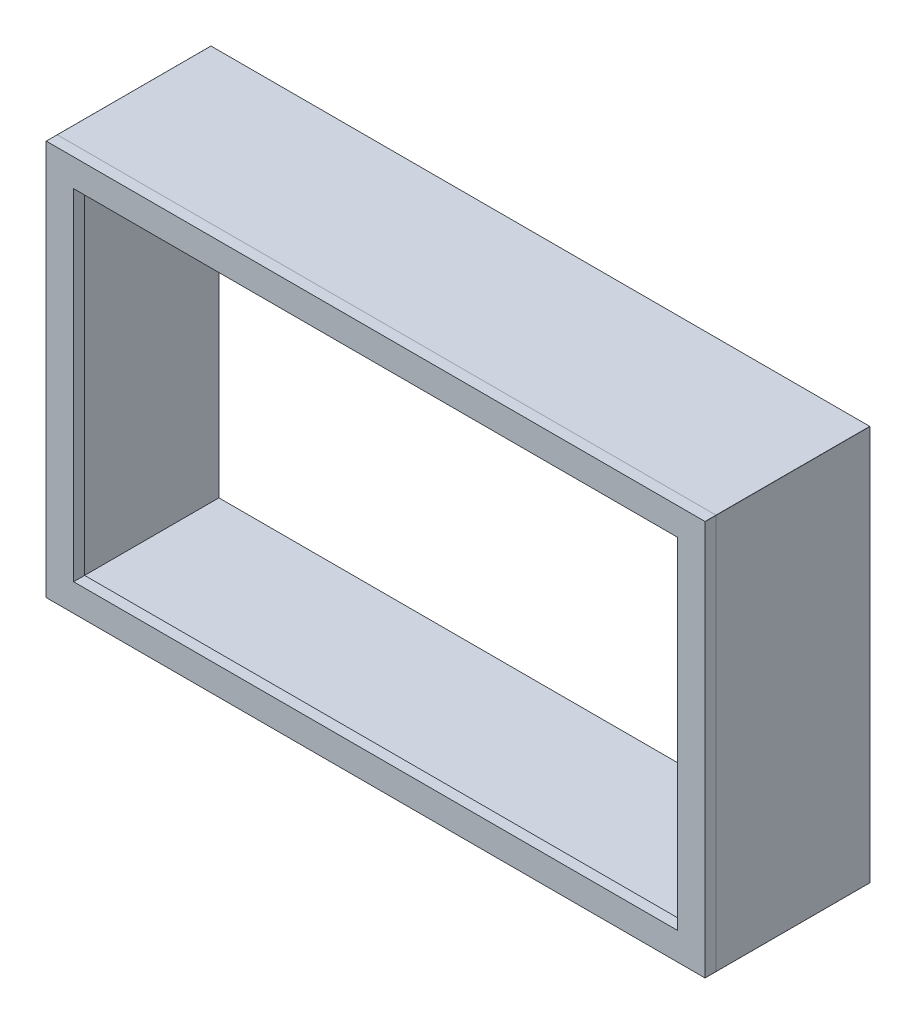
ISO-10303-21;
HEADER;
FILE_DESCRIPTION(('STEP AP214'),'2;1');
FILE_NAME('part.step','',(''),(''),'','','');
FILE_SCHEMA(('AUTOMOTIVE_DESIGN { 1 0 10303 214 1 1 1 1 }'));
ENDSEC;
DATA;
#1=APPLICATION_CONTEXT('core data for automotive mechanical design processes');
#2=APPLICATION_PROTOCOL_DEFINITION('international standard','automotive_design',2000,#1);
#3=PRODUCT_CONTEXT('',#1,'mechanical');
#4=PRODUCT('Part','Part','',(#3));
#5=PRODUCT_RELATED_PRODUCT_CATEGORY('part','',(#4));
#6=PRODUCT_DEFINITION_FORMATION('','',#4);
#7=PRODUCT_DEFINITION_CONTEXT('part definition',#1,'design');
#8=PRODUCT_DEFINITION('design','',#6,#7);
#9=PRODUCT_DEFINITION_SHAPE('','',#8);
#10=(LENGTH_UNIT() NAMED_UNIT(*) SI_UNIT(.MILLI.,.METRE.));
#11=(NAMED_UNIT(*) PLANE_ANGLE_UNIT() SI_UNIT($,.RADIAN.));
#12=(NAMED_UNIT(*) SI_UNIT($,.STERADIAN.) SOLID_ANGLE_UNIT());
#13=UNCERTAINTY_MEASURE_WITH_UNIT(LENGTH_MEASURE(1.E-05),#10,'distance_accuracy_value','');
#14=(GEOMETRIC_REPRESENTATION_CONTEXT(3) GLOBAL_UNCERTAINTY_ASSIGNED_CONTEXT((#13)) GLOBAL_UNIT_ASSIGNED_CONTEXT((#10,
#11,#12)) REPRESENTATION_CONTEXT('',''));
#15=CARTESIAN_POINT('',(0.,0.,0.));
#16=DIRECTION('',(0.,0.,1.));
#17=DIRECTION('',(1.,0.,0.));
#18=AXIS2_PLACEMENT_3D('',#15,#16,#17);
#19=CARTESIAN_POINT('',(-761.746,-456.946,228.6));
#20=DIRECTION('',(0.,0.,1.));
#21=DIRECTION('',(1.,0.,0.));
#22=AXIS2_PLACEMENT_3D('',#19,#20,#21);
#23=PLANE('',#22);
#24=CARTESIAN_POINT('',(-761.746,-456.946,228.6));
#25=DIRECTION('',(0.,0.,1.));
#26=DIRECTION('',(1.,0.,0.));
#27=AXIS2_PLACEMENT_3D('',#24,#25,#26);
#28=CIRCLE('',#27,0.253999999999949);
#29=CARTESIAN_POINT('',(-762.,-456.946,228.6));
#30=VERTEX_POINT('',#29);
#31=CARTESIAN_POINT('',(-761.746,-457.2,228.6));
#32=VERTEX_POINT('',#31);
#33=EDGE_CURVE('E280',#30,#32,#28,.T.);
#34=ORIENTED_EDGE('',*,*,#33,.T.);
#35=DIRECTION('',(1.,0.,0.));
#36=VECTOR('',#35,1.);
#37=CARTESIAN_POINT('',(-761.746,-457.2,228.6));
#38=LINE('',#37,#36);
#39=CARTESIAN_POINT('',(761.746,-457.2,228.6));
#40=VERTEX_POINT('',#39);
#41=EDGE_CURVE('E283',#32,#40,#38,.T.);
#42=ORIENTED_EDGE('',*,*,#41,.T.);
#43=CARTESIAN_POINT('',(761.746,-456.946,228.6));
#44=DIRECTION('',(0.,0.,1.));
#45=DIRECTION('',(1.,0.,0.));
#46=AXIS2_PLACEMENT_3D('',#43,#44,#45);
#47=CIRCLE('',#46,0.253999999999976);
#48=CARTESIAN_POINT('',(762.,-456.946,228.6));
#49=VERTEX_POINT('',#48);
#50=EDGE_CURVE('E286',#40,#49,#47,.T.);
#51=ORIENTED_EDGE('',*,*,#50,.T.);
#52=DIRECTION('',(0.,1.,0.));
#53=VECTOR('',#52,1.);
#54=CARTESIAN_POINT('',(762.,-456.946,228.6));
#55=LINE('',#54,#53);
#56=CARTESIAN_POINT('',(762.,456.946,228.6));
#57=VERTEX_POINT('',#56);
#58=EDGE_CURVE('E288',#49,#57,#55,.T.);
#59=ORIENTED_EDGE('',*,*,#58,.T.);
#60=CARTESIAN_POINT('',(761.746,456.946,228.6));
#61=DIRECTION('',(0.,0.,1.));
#62=DIRECTION('',(1.,0.,0.));
#63=AXIS2_PLACEMENT_3D('',#60,#61,#62);
#64=CIRCLE('',#63,0.253999999999976);
#65=CARTESIAN_POINT('',(761.746,457.2,228.6));
#66=VERTEX_POINT('',#65);
#67=EDGE_CURVE('E290',#57,#66,#64,.T.);
#68=ORIENTED_EDGE('',*,*,#67,.T.);
#69=DIRECTION('',(-1.,0.,0.));
#70=VECTOR('',#69,1.);
#71=CARTESIAN_POINT('',(761.746,457.2,228.6));
#72=LINE('',#71,#70);
#73=CARTESIAN_POINT('',(-761.746,457.2,228.6));
#74=VERTEX_POINT('',#73);
#75=EDGE_CURVE('E292',#66,#74,#72,.T.);
#76=ORIENTED_EDGE('',*,*,#75,.T.);
#77=CARTESIAN_POINT('',(-761.746,456.946,228.6));
#78=DIRECTION('',(0.,0.,1.));
#79=DIRECTION('',(1.,0.,0.));
#80=AXIS2_PLACEMENT_3D('',#77,#78,#79);
#81=CIRCLE('',#80,0.254000000000004);
#82=CARTESIAN_POINT('',(-762.,456.946,228.6));
#83=VERTEX_POINT('',#82);
#84=EDGE_CURVE('E294',#74,#83,#81,.T.);
#85=ORIENTED_EDGE('',*,*,#84,.T.);
#86=DIRECTION('',(0.,-1.,0.));
#87=VECTOR('',#86,1.);
#88=CARTESIAN_POINT('',(-762.,456.946,228.6));
#89=LINE('',#88,#87);
#90=EDGE_CURVE('E296',#83,#30,#89,.T.);
#91=ORIENTED_EDGE('',*,*,#90,.T.);
#92=EDGE_LOOP('',(#34,#42,#51,#59,#68,#76,#85,#91));
#93=FACE_BOUND('',#92,.T.);
#94=DIRECTION('',(0.,1.,0.));
#95=VECTOR('',#94,1.);
#96=CARTESIAN_POINT('',(698.5,-456.946,228.6));
#97=LINE('',#96,#95);
#98=CARTESIAN_POINT('',(698.5,-393.7,228.6));
#99=VERTEX_POINT('',#98);
#100=CARTESIAN_POINT('',(698.5,393.7,228.6));
#101=VERTEX_POINT('',#100);
#102=EDGE_CURVE('E252',#99,#101,#97,.T.);
#103=ORIENTED_EDGE('',*,*,#102,.F.);
#104=DIRECTION('',(1.,0.,0.));
#105=VECTOR('',#104,1.);
#106=CARTESIAN_POINT('',(-761.746,-393.7,228.6));
#107=LINE('',#106,#105);
#108=CARTESIAN_POINT('',(-698.5,-393.7,228.6));
#109=VERTEX_POINT('',#108);
#110=EDGE_CURVE('E244',#109,#99,#107,.T.);
#111=ORIENTED_EDGE('',*,*,#110,.F.);
#112=DIRECTION('',(0.,-1.,0.));
#113=VECTOR('',#112,1.);
#114=CARTESIAN_POINT('',(-698.5,456.946,228.6));
#115=LINE('',#114,#113);
#116=CARTESIAN_POINT('',(-698.5,393.7,228.6));
#117=VERTEX_POINT('',#116);
#118=EDGE_CURVE('E266',#117,#109,#115,.T.);
#119=ORIENTED_EDGE('',*,*,#118,.F.);
#120=DIRECTION('',(-1.,0.,0.));
#121=VECTOR('',#120,1.);
#122=CARTESIAN_POINT('',(761.746,393.7,228.6));
#123=LINE('',#122,#121);
#124=EDGE_CURVE('E264',#101,#117,#123,.T.);
#125=ORIENTED_EDGE('',*,*,#124,.F.);
#126=EDGE_LOOP('',(#103,#111,#119,#125));
#127=FACE_BOUND('',#126,.T.);
#128=ADVANCED_FACE('F155',(#93,#127),#23,.T.);
#129=CARTESIAN_POINT('',(-761.746,-456.946,203.2));
#130=DIRECTION('',(0.,0.,1.));
#131=DIRECTION('',(1.,0.,0.));
#132=AXIS2_PLACEMENT_3D('',#129,#130,#131);
#133=PLANE('',#132);
#134=CARTESIAN_POINT('',(-761.746,-456.946,203.2));
#135=DIRECTION('',(0.,0.,1.));
#136=DIRECTION('',(1.,0.,0.));
#137=AXIS2_PLACEMENT_3D('',#134,#135,#136);
#138=CIRCLE('',#137,0.253999999999949);
#139=CARTESIAN_POINT('',(-762.,-456.946,203.2));
#140=VERTEX_POINT('',#139);
#141=CARTESIAN_POINT('',(-761.746,-457.2,203.2));
#142=VERTEX_POINT('',#141);
#143=EDGE_CURVE('E260',#140,#142,#138,.T.);
#144=ORIENTED_EDGE('',*,*,#143,.F.);
#145=DIRECTION('',(0.,-1.,0.));
#146=VECTOR('',#145,1.);
#147=CARTESIAN_POINT('',(-762.,456.946,203.2));
#148=LINE('',#147,#146);
#149=CARTESIAN_POINT('',(-762.,456.946,203.2));
#150=VERTEX_POINT('',#149);
#151=EDGE_CURVE('E284',#150,#140,#148,.T.);
#152=ORIENTED_EDGE('',*,*,#151,.F.);
#153=CARTESIAN_POINT('',(-761.746,456.946,203.2));
#154=DIRECTION('',(0.,0.,1.));
#155=DIRECTION('',(1.,0.,0.));
#156=AXIS2_PLACEMENT_3D('',#153,#154,#155);
#157=CIRCLE('',#156,0.254000000000004);
#158=CARTESIAN_POINT('',(-761.746,457.2,203.2));
#159=VERTEX_POINT('',#158);
#160=EDGE_CURVE('E311',#159,#150,#157,.T.);
#161=ORIENTED_EDGE('',*,*,#160,.F.);
#162=DIRECTION('',(-1.,0.,0.));
#163=VECTOR('',#162,1.);
#164=CARTESIAN_POINT('',(761.746,457.2,203.2));
#165=LINE('',#164,#163);
#166=CARTESIAN_POINT('',(761.746,457.2,203.2));
#167=VERTEX_POINT('',#166);
#168=EDGE_CURVE('E309',#167,#159,#165,.T.);
#169=ORIENTED_EDGE('',*,*,#168,.F.);
#170=CARTESIAN_POINT('',(761.746,456.946,203.2));
#171=DIRECTION('',(0.,0.,1.));
#172=DIRECTION('',(1.,0.,0.));
#173=AXIS2_PLACEMENT_3D('',#170,#171,#172);
#174=CIRCLE('',#173,0.253999999999976);
#175=CARTESIAN_POINT('',(762.,456.946,203.2));
#176=VERTEX_POINT('',#175);
#177=EDGE_CURVE('E307',#176,#167,#174,.T.);
#178=ORIENTED_EDGE('',*,*,#177,.F.);
#179=DIRECTION('',(0.,1.,0.));
#180=VECTOR('',#179,1.);
#181=CARTESIAN_POINT('',(762.,-456.946,203.2));
#182=LINE('',#181,#180);
#183=CARTESIAN_POINT('',(762.,-456.946,203.2));
#184=VERTEX_POINT('',#183);
#185=EDGE_CURVE('E305',#184,#176,#182,.T.);
#186=ORIENTED_EDGE('',*,*,#185,.F.);
#187=CARTESIAN_POINT('',(761.746,-456.946,203.2));
#188=DIRECTION('',(0.,0.,1.));
#189=DIRECTION('',(1.,0.,0.));
#190=AXIS2_PLACEMENT_3D('',#187,#188,#189);
#191=CIRCLE('',#190,0.253999999999976);
#192=CARTESIAN_POINT('',(761.746,-457.2,203.2));
#193=VERTEX_POINT('',#192);
#194=EDGE_CURVE('E303',#193,#184,#191,.T.);
#195=ORIENTED_EDGE('',*,*,#194,.F.);
#196=DIRECTION('',(1.,0.,0.));
#197=VECTOR('',#196,1.);
#198=CARTESIAN_POINT('',(-761.746,-457.2,203.2));
#199=LINE('',#198,#197);
#200=EDGE_CURVE('E301',#142,#193,#199,.T.);
#201=ORIENTED_EDGE('',*,*,#200,.F.);
#202=EDGE_LOOP('',(#144,#152,#161,#169,#178,#186,#195,#201));
#203=FACE_BOUND('',#202,.T.);
#204=DIRECTION('',(1.,0.,0.));
#205=VECTOR('',#204,1.);
#206=CARTESIAN_POINT('',(-761.746,-393.7,203.2));
#207=LINE('',#206,#205);
#208=CARTESIAN_POINT('',(-698.5,-393.7,203.2));
#209=VERTEX_POINT('',#208);
#210=CARTESIAN_POINT('',(698.5,-393.7,203.2));
#211=VERTEX_POINT('',#210);
#212=EDGE_CURVE('E178',#209,#211,#207,.T.);
#213=ORIENTED_EDGE('',*,*,#212,.T.);
#214=DIRECTION('',(0.,1.,0.));
#215=VECTOR('',#214,1.);
#216=CARTESIAN_POINT('',(698.5,-456.946,203.2));
#217=LINE('',#216,#215);
#218=CARTESIAN_POINT('',(698.5,393.7,203.2));
#219=VERTEX_POINT('',#218);
#220=EDGE_CURVE('E259',#211,#219,#217,.T.);
#221=ORIENTED_EDGE('',*,*,#220,.T.);
#222=DIRECTION('',(-1.,0.,0.));
#223=VECTOR('',#222,1.);
#224=CARTESIAN_POINT('',(761.746,393.7,203.2));
#225=LINE('',#224,#223);
#226=CARTESIAN_POINT('',(-698.5,393.7,203.2));
#227=VERTEX_POINT('',#226);
#228=EDGE_CURVE('E272',#219,#227,#225,.T.);
#229=ORIENTED_EDGE('',*,*,#228,.T.);
#230=DIRECTION('',(0.,-1.,0.));
#231=VECTOR('',#230,1.);
#232=CARTESIAN_POINT('',(-698.5,456.946,203.2));
#233=LINE('',#232,#231);
#234=EDGE_CURVE('E253',#227,#209,#233,.T.);
#235=ORIENTED_EDGE('',*,*,#234,.T.);
#236=EDGE_LOOP('',(#213,#221,#229,#235));
#237=FACE_BOUND('',#236,.T.);
#238=ADVANCED_FACE('F341',(#203,#237),#133,.F.);
#239=CARTESIAN_POINT('',(-761.746,-456.946,228.6));
#240=DIRECTION('',(0.,0.,-1.));
#241=DIRECTION('',(-1.,0.,0.));
#242=AXIS2_PLACEMENT_3D('',#239,#240,#241);
#243=CYLINDRICAL_SURFACE('',#242,0.253999999999949);
#244=ORIENTED_EDGE('',*,*,#143,.T.);
#245=DIRECTION('',(0.,0.,-1.));
#246=VECTOR('',#245,1.);
#247=CARTESIAN_POINT('',(-761.746,-457.2,228.6));
#248=LINE('',#247,#246);
#249=EDGE_CURVE('E13',#32,#142,#248,.T.);
#250=ORIENTED_EDGE('',*,*,#249,.F.);
#251=ORIENTED_EDGE('',*,*,#33,.F.);
#252=DIRECTION('',(0.,0.,-1.));
#253=VECTOR('',#252,1.);
#254=CARTESIAN_POINT('',(-762.,-456.946,228.6));
#255=LINE('',#254,#253);
#256=EDGE_CURVE('E298',#30,#140,#255,.T.);
#257=ORIENTED_EDGE('',*,*,#256,.T.);
#258=EDGE_LOOP('',(#244,#250,#251,#257));
#259=FACE_BOUND('',#258,.T.);
#260=ADVANCED_FACE('F157',(#259),#243,.T.);
#261=CARTESIAN_POINT('',(-761.746,-457.2,228.6));
#262=DIRECTION('',(0.,1.,0.));
#263=DIRECTION('',(-1.,0.,0.));
#264=AXIS2_PLACEMENT_3D('',#261,#262,#263);
#265=PLANE('',#264);
#266=ORIENTED_EDGE('',*,*,#200,.T.);
#267=DIRECTION('',(0.,0.,-1.));
#268=VECTOR('',#267,1.);
#269=CARTESIAN_POINT('',(761.746,-457.2,228.6));
#270=LINE('',#269,#268);
#271=EDGE_CURVE('E163',#40,#193,#270,.T.);
#272=ORIENTED_EDGE('',*,*,#271,.F.);
#273=ORIENTED_EDGE('',*,*,#41,.F.);
#274=ORIENTED_EDGE('',*,*,#249,.T.);
#275=EDGE_LOOP('',(#266,#272,#273,#274));
#276=FACE_BOUND('',#275,.T.);
#277=ADVANCED_FACE('F358',(#276),#265,.F.);
#278=CARTESIAN_POINT('',(761.746,-456.946,228.6));
#279=DIRECTION('',(0.,0.,-1.));
#280=DIRECTION('',(-1.,0.,0.));
#281=AXIS2_PLACEMENT_3D('',#278,#279,#280);
#282=CYLINDRICAL_SURFACE('',#281,0.253999999999976);
#283=ORIENTED_EDGE('',*,*,#194,.T.);
#284=DIRECTION('',(0.,0.,-1.));
#285=VECTOR('',#284,1.);
#286=CARTESIAN_POINT('',(762.,-456.946,228.6));
#287=LINE('',#286,#285);
#288=EDGE_CURVE('E328',#49,#184,#287,.T.);
#289=ORIENTED_EDGE('',*,*,#288,.F.);
#290=ORIENTED_EDGE('',*,*,#50,.F.);
#291=ORIENTED_EDGE('',*,*,#271,.T.);
#292=EDGE_LOOP('',(#283,#289,#290,#291));
#293=FACE_BOUND('',#292,.T.);
#294=ADVANCED_FACE('F335',(#293),#282,.T.);
#295=CARTESIAN_POINT('',(762.,-456.946,228.6));
#296=DIRECTION('',(-1.,0.,0.));
#297=DIRECTION('',(0.,0.,1.));
#298=AXIS2_PLACEMENT_3D('',#295,#296,#297);
#299=PLANE('',#298);
#300=ORIENTED_EDGE('',*,*,#185,.T.);
#301=DIRECTION('',(0.,0.,-1.));
#302=VECTOR('',#301,1.);
#303=CARTESIAN_POINT('',(762.,456.946,228.6));
#304=LINE('',#303,#302);
#305=EDGE_CURVE('E325',#57,#176,#304,.T.);
#306=ORIENTED_EDGE('',*,*,#305,.F.);
#307=ORIENTED_EDGE('',*,*,#58,.F.);
#308=ORIENTED_EDGE('',*,*,#288,.T.);
#309=EDGE_LOOP('',(#300,#306,#307,#308));
#310=FACE_BOUND('',#309,.T.);
#311=ADVANCED_FACE('F347',(#310),#299,.F.);
#312=CARTESIAN_POINT('',(761.746,456.946,228.6));
#313=DIRECTION('',(0.,0.,-1.));
#314=DIRECTION('',(-1.,0.,0.));
#315=AXIS2_PLACEMENT_3D('',#312,#313,#314);
#316=CYLINDRICAL_SURFACE('',#315,0.253999999999976);
#317=ORIENTED_EDGE('',*,*,#177,.T.);
#318=DIRECTION('',(0.,0.,-1.));
#319=VECTOR('',#318,1.);
#320=CARTESIAN_POINT('',(761.746,457.2,228.6));
#321=LINE('',#320,#319);
#322=EDGE_CURVE('E322',#66,#167,#321,.T.);
#323=ORIENTED_EDGE('',*,*,#322,.F.);
#324=ORIENTED_EDGE('',*,*,#67,.F.);
#325=ORIENTED_EDGE('',*,*,#305,.T.);
#326=EDGE_LOOP('',(#317,#323,#324,#325));
#327=FACE_BOUND('',#326,.T.);
#328=ADVANCED_FACE('F351',(#327),#316,.T.);
#329=CARTESIAN_POINT('',(761.746,457.2,228.6));
#330=DIRECTION('',(0.,-1.,0.));
#331=DIRECTION('',(1.,0.,0.));
#332=AXIS2_PLACEMENT_3D('',#329,#330,#331);
#333=PLANE('',#332);
#334=ORIENTED_EDGE('',*,*,#168,.T.);
#335=DIRECTION('',(0.,0.,-1.));
#336=VECTOR('',#335,1.);
#337=CARTESIAN_POINT('',(-761.746,457.2,228.6));
#338=LINE('',#337,#336);
#339=EDGE_CURVE('E319',#74,#159,#338,.T.);
#340=ORIENTED_EDGE('',*,*,#339,.F.);
#341=ORIENTED_EDGE('',*,*,#75,.F.);
#342=ORIENTED_EDGE('',*,*,#322,.T.);
#343=EDGE_LOOP('',(#334,#340,#341,#342));
#344=FACE_BOUND('',#343,.T.);
#345=ADVANCED_FACE('F371',(#344),#333,.F.);
#346=CARTESIAN_POINT('',(-761.746,456.946,228.6));
#347=DIRECTION('',(0.,0.,-1.));
#348=DIRECTION('',(-1.,0.,0.));
#349=AXIS2_PLACEMENT_3D('',#346,#347,#348);
#350=CYLINDRICAL_SURFACE('',#349,0.254000000000004);
#351=ORIENTED_EDGE('',*,*,#160,.T.);
#352=DIRECTION('',(0.,0.,-1.));
#353=VECTOR('',#352,1.);
#354=CARTESIAN_POINT('',(-762.,456.946,228.6));
#355=LINE('',#354,#353);
#356=EDGE_CURVE('E316',#83,#150,#355,.T.);
#357=ORIENTED_EDGE('',*,*,#356,.F.);
#358=ORIENTED_EDGE('',*,*,#84,.F.);
#359=ORIENTED_EDGE('',*,*,#339,.T.);
#360=EDGE_LOOP('',(#351,#357,#358,#359));
#361=FACE_BOUND('',#360,.T.);
#362=ADVANCED_FACE('F369',(#361),#350,.T.);
#363=CARTESIAN_POINT('',(-762.,456.946,228.6));
#364=DIRECTION('',(1.,0.,0.));
#365=DIRECTION('',(0.,0.,-1.));
#366=AXIS2_PLACEMENT_3D('',#363,#364,#365);
#367=PLANE('',#366);
#368=ORIENTED_EDGE('',*,*,#151,.T.);
#369=ORIENTED_EDGE('',*,*,#256,.F.);
#370=ORIENTED_EDGE('',*,*,#90,.F.);
#371=ORIENTED_EDGE('',*,*,#356,.T.);
#372=EDGE_LOOP('',(#368,#369,#370,#371));
#373=FACE_BOUND('',#372,.T.);
#374=ADVANCED_FACE('F364',(#373),#367,.F.);
#375=CARTESIAN_POINT('',(-761.746,-393.7,228.6));
#376=DIRECTION('',(0.,1.,0.));
#377=DIRECTION('',(-1.,0.,0.));
#378=AXIS2_PLACEMENT_3D('',#375,#376,#377);
#379=PLANE('',#378);
#380=ORIENTED_EDGE('',*,*,#212,.F.);
#381=DIRECTION('',(0.,0.,-1.));
#382=VECTOR('',#381,1.);
#383=CARTESIAN_POINT('',(-698.5,-393.7,228.6));
#384=LINE('',#383,#382);
#385=EDGE_CURVE('E248',#109,#209,#384,.T.);
#386=ORIENTED_EDGE('',*,*,#385,.F.);
#387=ORIENTED_EDGE('',*,*,#110,.T.);
#388=DIRECTION('',(0.,0.,-1.));
#389=VECTOR('',#388,1.);
#390=CARTESIAN_POINT('',(698.5,-393.7,228.6));
#391=LINE('',#390,#389);
#392=EDGE_CURVE('E247',#99,#211,#391,.T.);
#393=ORIENTED_EDGE('',*,*,#392,.T.);
#394=EDGE_LOOP('',(#380,#386,#387,#393));
#395=FACE_BOUND('',#394,.T.);
#396=ADVANCED_FACE('F246',(#395),#379,.T.);
#397=CARTESIAN_POINT('',(698.5,-456.946,228.6));
#398=DIRECTION('',(-1.,0.,0.));
#399=DIRECTION('',(0.,0.,1.));
#400=AXIS2_PLACEMENT_3D('',#397,#398,#399);
#401=PLANE('',#400);
#402=ORIENTED_EDGE('',*,*,#220,.F.);
#403=ORIENTED_EDGE('',*,*,#392,.F.);
#404=ORIENTED_EDGE('',*,*,#102,.T.);
#405=DIRECTION('',(0.,0.,-1.));
#406=VECTOR('',#405,1.);
#407=CARTESIAN_POINT('',(698.5,393.7,228.6));
#408=LINE('',#407,#406);
#409=EDGE_CURVE('E261',#101,#219,#408,.T.);
#410=ORIENTED_EDGE('',*,*,#409,.T.);
#411=EDGE_LOOP('',(#402,#403,#404,#410));
#412=FACE_BOUND('',#411,.T.);
#413=ADVANCED_FACE('F256',(#412),#401,.T.);
#414=CARTESIAN_POINT('',(761.746,393.7,228.6));
#415=DIRECTION('',(0.,-1.,0.));
#416=DIRECTION('',(1.,0.,0.));
#417=AXIS2_PLACEMENT_3D('',#414,#415,#416);
#418=PLANE('',#417);
#419=ORIENTED_EDGE('',*,*,#228,.F.);
#420=ORIENTED_EDGE('',*,*,#409,.F.);
#421=ORIENTED_EDGE('',*,*,#124,.T.);
#422=DIRECTION('',(0.,0.,-1.));
#423=VECTOR('',#422,1.);
#424=CARTESIAN_POINT('',(-698.5,393.7,228.6));
#425=LINE('',#424,#423);
#426=EDGE_CURVE('E170',#117,#227,#425,.T.);
#427=ORIENTED_EDGE('',*,*,#426,.T.);
#428=EDGE_LOOP('',(#419,#420,#421,#427));
#429=FACE_BOUND('',#428,.T.);
#430=ADVANCED_FACE('F396',(#429),#418,.T.);
#431=CARTESIAN_POINT('',(-698.5,456.946,228.6));
#432=DIRECTION('',(1.,0.,0.));
#433=DIRECTION('',(0.,0.,-1.));
#434=AXIS2_PLACEMENT_3D('',#431,#432,#433);
#435=PLANE('',#434);
#436=ORIENTED_EDGE('',*,*,#234,.F.);
#437=ORIENTED_EDGE('',*,*,#426,.F.);
#438=ORIENTED_EDGE('',*,*,#118,.T.);
#439=ORIENTED_EDGE('',*,*,#385,.T.);
#440=EDGE_LOOP('',(#436,#437,#438,#439));
#441=FACE_BOUND('',#440,.T.);
#442=ADVANCED_FACE('F400',(#441),#435,.T.);
#443=CLOSED_SHELL('',(#128,#238,#260,#277,#294,#311,#328,#345,#362,#374,#396,#413,#430,#442));
#444=MANIFOLD_SOLID_BREP('B2',#443);
#445=CARTESIAN_POINT('',(-761.746,-456.946,-152.4));
#446=DIRECTION('',(0.,0.,1.));
#447=DIRECTION('',(1.,0.,0.));
#448=AXIS2_PLACEMENT_3D('',#445,#446,#447);
#449=CYLINDRICAL_SURFACE('',#448,0.253999999999949);
#450=DIRECTION('',(0.,0.,1.));
#451=VECTOR('',#450,1.);
#452=CARTESIAN_POINT('',(-761.746,-457.2,-152.4));
#453=LINE('',#452,#451);
#454=CARTESIAN_POINT('',(-761.746,-457.2,-152.4));
#455=VERTEX_POINT('',#454);
#456=CARTESIAN_POINT('',(-761.746,-457.2,203.2));
#457=VERTEX_POINT('',#456);
#458=EDGE_CURVE('E492',#455,#457,#453,.T.);
#459=ORIENTED_EDGE('',*,*,#458,.T.);
#460=CARTESIAN_POINT('',(-761.746,-456.946,203.2));
#461=DIRECTION('',(0.,0.,1.));
#462=DIRECTION('',(-1.,0.,0.));
#463=AXIS2_PLACEMENT_3D('',#460,#461,#462);
#464=CIRCLE('',#463,0.253999999999949);
#465=CARTESIAN_POINT('',(-762.,-456.946,203.2));
#466=VERTEX_POINT('',#465);
#467=EDGE_CURVE('E608',#466,#457,#464,.T.);
#468=ORIENTED_EDGE('',*,*,#467,.F.);
#469=DIRECTION('',(0.,0.,1.));
#470=VECTOR('',#469,1.);
#471=CARTESIAN_POINT('',(-762.,-456.946,-152.4));
#472=LINE('',#471,#470);
#473=CARTESIAN_POINT('',(-762.,-456.946,-152.4));
#474=VERTEX_POINT('',#473);
#475=EDGE_CURVE('E153',#474,#466,#472,.T.);
#476=ORIENTED_EDGE('',*,*,#475,.F.);
#477=CARTESIAN_POINT('',(-761.746,-456.946,-152.4));
#478=DIRECTION('',(0.,0.,1.));
#479=DIRECTION('',(-1.,0.,0.));
#480=AXIS2_PLACEMENT_3D('',#477,#478,#479);
#481=CIRCLE('',#480,0.253999999999949);
#482=EDGE_CURVE('E639',#474,#455,#481,.T.);
#483=ORIENTED_EDGE('',*,*,#482,.T.);
#484=EDGE_LOOP('',(#459,#468,#476,#483));
#485=FACE_BOUND('',#484,.T.);
#486=ADVANCED_FACE('F489',(#485),#449,.T.);
#487=CARTESIAN_POINT('',(-762.,-456.946,-152.4));
#488=DIRECTION('',(-1.,0.,0.));
#489=DIRECTION('',(0.,0.,1.));
#490=AXIS2_PLACEMENT_3D('',#487,#488,#489);
#491=PLANE('',#490);
#492=ORIENTED_EDGE('',*,*,#475,.T.);
#493=DIRECTION('',(0.,-1.,0.));
#494=VECTOR('',#493,1.);
#495=CARTESIAN_POINT('',(-762.,-456.946,203.2));
#496=LINE('',#495,#494);
#497=CARTESIAN_POINT('',(-762.,456.946,203.2));
#498=VERTEX_POINT('',#497);
#499=EDGE_CURVE('E629',#498,#466,#496,.T.);
#500=ORIENTED_EDGE('',*,*,#499,.F.);
#501=DIRECTION('',(0.,0.,1.));
#502=VECTOR('',#501,1.);
#503=CARTESIAN_POINT('',(-762.,456.946,-152.4));
#504=LINE('',#503,#502);
#505=CARTESIAN_POINT('',(-762.,456.946,-152.4));
#506=VERTEX_POINT('',#505);
#507=EDGE_CURVE('E497',#506,#498,#504,.T.);
#508=ORIENTED_EDGE('',*,*,#507,.F.);
#509=DIRECTION('',(0.,-1.,0.));
#510=VECTOR('',#509,1.);
#511=CARTESIAN_POINT('',(-762.,-456.946,-152.4));
#512=LINE('',#511,#510);
#513=EDGE_CURVE('E662',#506,#474,#512,.T.);
#514=ORIENTED_EDGE('',*,*,#513,.T.);
#515=EDGE_LOOP('',(#492,#500,#508,#514));
#516=FACE_BOUND('',#515,.T.);
#517=ADVANCED_FACE('F683',(#516),#491,.T.);
#518=CARTESIAN_POINT('',(-761.746,456.946,-152.4));
#519=DIRECTION('',(0.,0.,1.));
#520=DIRECTION('',(1.,0.,0.));
#521=AXIS2_PLACEMENT_3D('',#518,#519,#520);
#522=CYLINDRICAL_SURFACE('',#521,0.254000000000004);
#523=ORIENTED_EDGE('',*,*,#507,.T.);
#524=CARTESIAN_POINT('',(-761.746,456.946,203.2));
#525=DIRECTION('',(0.,0.,1.));
#526=DIRECTION('',(1.,0.,0.));
#527=AXIS2_PLACEMENT_3D('',#524,#525,#526);
#528=CIRCLE('',#527,0.254000000000004);
#529=CARTESIAN_POINT('',(-761.746,457.2,203.2));
#530=VERTEX_POINT('',#529);
#531=EDGE_CURVE('E626',#530,#498,#528,.T.);
#532=ORIENTED_EDGE('',*,*,#531,.F.);
#533=DIRECTION('',(0.,0.,1.));
#534=VECTOR('',#533,1.);
#535=CARTESIAN_POINT('',(-761.746,457.2,-152.4));
#536=LINE('',#535,#534);
#537=CARTESIAN_POINT('',(-761.746,457.2,-152.4));
#538=VERTEX_POINT('',#537);
#539=EDGE_CURVE('E666',#538,#530,#536,.T.);
#540=ORIENTED_EDGE('',*,*,#539,.F.);
#541=CARTESIAN_POINT('',(-761.746,456.946,-152.4));
#542=DIRECTION('',(0.,0.,1.));
#543=DIRECTION('',(1.,0.,0.));
#544=AXIS2_PLACEMENT_3D('',#541,#542,#543);
#545=CIRCLE('',#544,0.254000000000004);
#546=EDGE_CURVE('E659',#538,#506,#545,.T.);
#547=ORIENTED_EDGE('',*,*,#546,.T.);
#548=EDGE_LOOP('',(#523,#532,#540,#547));
#549=FACE_BOUND('',#548,.T.);
#550=ADVANCED_FACE('F704',(#549),#522,.T.);
#551=CARTESIAN_POINT('',(761.746,457.2,-152.4));
#552=DIRECTION('',(0.,1.,0.));
#553=DIRECTION('',(-1.,0.,0.));
#554=AXIS2_PLACEMENT_3D('',#551,#552,#553);
#555=PLANE('',#554);
#556=ORIENTED_EDGE('',*,*,#539,.T.);
#557=DIRECTION('',(-1.,0.,0.));
#558=VECTOR('',#557,1.);
#559=CARTESIAN_POINT('',(761.746,457.2,203.2));
#560=LINE('',#559,#558);
#561=CARTESIAN_POINT('',(761.746,457.2,203.2));
#562=VERTEX_POINT('',#561);
#563=EDGE_CURVE('E623',#562,#530,#560,.T.);
#564=ORIENTED_EDGE('',*,*,#563,.F.);
#565=DIRECTION('',(0.,0.,1.));
#566=VECTOR('',#565,1.);
#567=CARTESIAN_POINT('',(761.746,457.2,-152.4));
#568=LINE('',#567,#566);
#569=CARTESIAN_POINT('',(761.746,457.2,-152.4));
#570=VERTEX_POINT('',#569);
#571=EDGE_CURVE('E668',#570,#562,#568,.T.);
#572=ORIENTED_EDGE('',*,*,#571,.F.);
#573=DIRECTION('',(-1.,0.,0.));
#574=VECTOR('',#573,1.);
#575=CARTESIAN_POINT('',(761.746,457.2,-152.4));
#576=LINE('',#575,#574);
#577=EDGE_CURVE('E656',#570,#538,#576,.T.);
#578=ORIENTED_EDGE('',*,*,#577,.T.);
#579=EDGE_LOOP('',(#556,#564,#572,#578));
#580=FACE_BOUND('',#579,.T.);
#581=ADVANCED_FACE('F701',(#580),#555,.T.);
#582=CARTESIAN_POINT('',(761.746,456.946,-152.4));
#583=DIRECTION('',(0.,0.,1.));
#584=DIRECTION('',(1.,0.,0.));
#585=AXIS2_PLACEMENT_3D('',#582,#583,#584);
#586=CYLINDRICAL_SURFACE('',#585,0.253999999999976);
#587=ORIENTED_EDGE('',*,*,#571,.T.);
#588=CARTESIAN_POINT('',(761.746,456.946,203.2));
#589=DIRECTION('',(0.,0.,1.));
#590=DIRECTION('',(1.,0.,0.));
#591=AXIS2_PLACEMENT_3D('',#588,#589,#590);
#592=CIRCLE('',#591,0.253999999999976);
#593=CARTESIAN_POINT('',(762.,456.946,203.2));
#594=VERTEX_POINT('',#593);
#595=EDGE_CURVE('E620',#594,#562,#592,.T.);
#596=ORIENTED_EDGE('',*,*,#595,.F.);
#597=DIRECTION('',(0.,0.,1.));
#598=VECTOR('',#597,1.);
#599=CARTESIAN_POINT('',(762.,456.946,-152.4));
#600=LINE('',#599,#598);
#601=CARTESIAN_POINT('',(762.,456.946,-152.4));
#602=VERTEX_POINT('',#601);
#603=EDGE_CURVE('E670',#602,#594,#600,.T.);
#604=ORIENTED_EDGE('',*,*,#603,.F.);
#605=CARTESIAN_POINT('',(761.746,456.946,-152.4));
#606=DIRECTION('',(0.,0.,1.));
#607=DIRECTION('',(1.,0.,0.));
#608=AXIS2_PLACEMENT_3D('',#605,#606,#607);
#609=CIRCLE('',#608,0.253999999999976);
#610=EDGE_CURVE('E653',#602,#570,#609,.T.);
#611=ORIENTED_EDGE('',*,*,#610,.T.);
#612=EDGE_LOOP('',(#587,#596,#604,#611));
#613=FACE_BOUND('',#612,.T.);
#614=ADVANCED_FACE('F699',(#613),#586,.T.);
#615=CARTESIAN_POINT('',(762.,-456.946,-152.4));
#616=DIRECTION('',(1.,0.,0.));
#617=DIRECTION('',(0.,0.,-1.));
#618=AXIS2_PLACEMENT_3D('',#615,#616,#617);
#619=PLANE('',#618);
#620=ORIENTED_EDGE('',*,*,#603,.T.);
#621=DIRECTION('',(0.,1.,0.));
#622=VECTOR('',#621,1.);
#623=CARTESIAN_POINT('',(762.,-456.946,203.2));
#624=LINE('',#623,#622);
#625=CARTESIAN_POINT('',(762.,-456.946,203.2));
#626=VERTEX_POINT('',#625);
#627=EDGE_CURVE('E617',#626,#594,#624,.T.);
#628=ORIENTED_EDGE('',*,*,#627,.F.);
#629=DIRECTION('',(0.,0.,1.));
#630=VECTOR('',#629,1.);
#631=CARTESIAN_POINT('',(762.,-456.946,-152.4));
#632=LINE('',#631,#630);
#633=CARTESIAN_POINT('',(762.,-456.946,-152.4));
#634=VERTEX_POINT('',#633);
#635=EDGE_CURVE('E672',#634,#626,#632,.T.);
#636=ORIENTED_EDGE('',*,*,#635,.F.);
#637=DIRECTION('',(0.,1.,0.));
#638=VECTOR('',#637,1.);
#639=CARTESIAN_POINT('',(762.,-456.946,-152.4));
#640=LINE('',#639,#638);
#641=EDGE_CURVE('E650',#634,#602,#640,.T.);
#642=ORIENTED_EDGE('',*,*,#641,.T.);
#643=EDGE_LOOP('',(#620,#628,#636,#642));
#644=FACE_BOUND('',#643,.T.);
#645=ADVANCED_FACE('F697',(#644),#619,.T.);
#646=CARTESIAN_POINT('',(761.746,-456.946,-152.4));
#647=DIRECTION('',(0.,0.,1.));
#648=DIRECTION('',(1.,0.,0.));
#649=AXIS2_PLACEMENT_3D('',#646,#647,#648);
#650=CYLINDRICAL_SURFACE('',#649,0.253999999999976);
#651=ORIENTED_EDGE('',*,*,#635,.T.);
#652=CARTESIAN_POINT('',(761.746,-456.946,203.2));
#653=DIRECTION('',(0.,0.,1.));
#654=DIRECTION('',(1.,0.,0.));
#655=AXIS2_PLACEMENT_3D('',#652,#653,#654);
#656=CIRCLE('',#655,0.253999999999976);
#657=CARTESIAN_POINT('',(761.746,-457.2,203.2));
#658=VERTEX_POINT('',#657);
#659=EDGE_CURVE('E614',#658,#626,#656,.T.);
#660=ORIENTED_EDGE('',*,*,#659,.F.);
#661=DIRECTION('',(0.,0.,1.));
#662=VECTOR('',#661,1.);
#663=CARTESIAN_POINT('',(761.746,-457.2,-152.4));
#664=LINE('',#663,#662);
#665=CARTESIAN_POINT('',(761.746,-457.2,-152.4));
#666=VERTEX_POINT('',#665);
#667=EDGE_CURVE('E673',#666,#658,#664,.T.);
#668=ORIENTED_EDGE('',*,*,#667,.F.);
#669=CARTESIAN_POINT('',(761.746,-456.946,-152.4));
#670=DIRECTION('',(0.,0.,1.));
#671=DIRECTION('',(1.,0.,0.));
#672=AXIS2_PLACEMENT_3D('',#669,#670,#671);
#673=CIRCLE('',#672,0.253999999999976);
#674=EDGE_CURVE('E647',#666,#634,#673,.T.);
#675=ORIENTED_EDGE('',*,*,#674,.T.);
#676=EDGE_LOOP('',(#651,#660,#668,#675));
#677=FACE_BOUND('',#676,.T.);
#678=ADVANCED_FACE('F693',(#677),#650,.T.);
#679=CARTESIAN_POINT('',(761.746,-457.2,-152.4));
#680=DIRECTION('',(0.,-1.,0.));
#681=DIRECTION('',(1.,0.,0.));
#682=AXIS2_PLACEMENT_3D('',#679,#680,#681);
#683=PLANE('',#682);
#684=ORIENTED_EDGE('',*,*,#667,.T.);
#685=DIRECTION('',(1.,0.,0.));
#686=VECTOR('',#685,1.);
#687=CARTESIAN_POINT('',(761.746,-457.2,203.2));
#688=LINE('',#687,#686);
#689=EDGE_CURVE('E611',#457,#658,#688,.T.);
#690=ORIENTED_EDGE('',*,*,#689,.F.);
#691=ORIENTED_EDGE('',*,*,#458,.F.);
#692=DIRECTION('',(1.,0.,0.));
#693=VECTOR('',#692,1.);
#694=CARTESIAN_POINT('',(761.746,-457.2,-152.4));
#695=LINE('',#694,#693);
#696=EDGE_CURVE('E644',#455,#666,#695,.T.);
#697=ORIENTED_EDGE('',*,*,#696,.T.);
#698=EDGE_LOOP('',(#684,#690,#691,#697));
#699=FACE_BOUND('',#698,.T.);
#700=ADVANCED_FACE('F677',(#699),#683,.T.);
#701=CARTESIAN_POINT('',(-761.746,-456.946,-152.4));
#702=DIRECTION('',(0.,0.,1.));
#703=DIRECTION('',(1.,0.,0.));
#704=AXIS2_PLACEMENT_3D('',#701,#702,#703);
#705=PLANE('',#704);
#706=DIRECTION('',(-1.,0.,0.));
#707=VECTOR('',#706,1.);
#708=CARTESIAN_POINT('',(-761.746,438.658,-152.4));
#709=LINE('',#708,#707);
#710=CARTESIAN_POINT('',(743.458,438.658,-152.4));
#711=VERTEX_POINT('',#710);
#712=CARTESIAN_POINT('',(-743.458,438.658,-152.4));
#713=VERTEX_POINT('',#712);
#714=EDGE_CURVE('E590',#711,#713,#709,.T.);
#715=ORIENTED_EDGE('',*,*,#714,.T.);
#716=DIRECTION('',(0.,-1.,0.));
#717=VECTOR('',#716,1.);
#718=CARTESIAN_POINT('',(-743.458,-456.946,-152.4));
#719=LINE('',#718,#717);
#720=CARTESIAN_POINT('',(-743.458,-438.658,-152.4));
#721=VERTEX_POINT('',#720);
#722=EDGE_CURVE('E632',#713,#721,#719,.T.);
#723=ORIENTED_EDGE('',*,*,#722,.T.);
#724=DIRECTION('',(1.,0.,0.));
#725=VECTOR('',#724,1.);
#726=CARTESIAN_POINT('',(-761.746,-438.658,-152.4));
#727=LINE('',#726,#725);
#728=CARTESIAN_POINT('',(743.458,-438.658,-152.4));
#729=VERTEX_POINT('',#728);
#730=EDGE_CURVE('E585',#721,#729,#727,.T.);
#731=ORIENTED_EDGE('',*,*,#730,.T.);
#732=DIRECTION('',(0.,1.,0.));
#733=VECTOR('',#732,1.);
#734=CARTESIAN_POINT('',(743.458,-456.946,-152.4));
#735=LINE('',#734,#733);
#736=EDGE_CURVE('E505',#729,#711,#735,.T.);
#737=ORIENTED_EDGE('',*,*,#736,.T.);
#738=EDGE_LOOP('',(#715,#723,#731,#737));
#739=FACE_BOUND('',#738,.T.);
#740=ORIENTED_EDGE('',*,*,#482,.F.);
#741=ORIENTED_EDGE('',*,*,#513,.F.);
#742=ORIENTED_EDGE('',*,*,#546,.F.);
#743=ORIENTED_EDGE('',*,*,#577,.F.);
#744=ORIENTED_EDGE('',*,*,#610,.F.);
#745=ORIENTED_EDGE('',*,*,#641,.F.);
#746=ORIENTED_EDGE('',*,*,#674,.F.);
#747=ORIENTED_EDGE('',*,*,#696,.F.);
#748=EDGE_LOOP('',(#740,#741,#742,#743,#744,#745,#746,#747));
#749=FACE_BOUND('',#748,.T.);
#750=ADVANCED_FACE('F687',(#739,#749),#705,.F.);
#751=CARTESIAN_POINT('',(-743.458,-456.946,-152.4));
#752=DIRECTION('',(-1.,0.,0.));
#753=DIRECTION('',(0.,0.,1.));
#754=AXIS2_PLACEMENT_3D('',#751,#752,#753);
#755=PLANE('',#754);
#756=DIRECTION('',(0.,0.,1.));
#757=VECTOR('',#756,1.);
#758=CARTESIAN_POINT('',(-743.458,438.658,-152.4));
#759=LINE('',#758,#757);
#760=CARTESIAN_POINT('',(-743.458,438.658,203.2));
#761=VERTEX_POINT('',#760);
#762=EDGE_CURVE('E595',#713,#761,#759,.T.);
#763=ORIENTED_EDGE('',*,*,#762,.T.);
#764=DIRECTION('',(0.,-1.,0.));
#765=VECTOR('',#764,1.);
#766=CARTESIAN_POINT('',(-743.458,-456.946,203.2));
#767=LINE('',#766,#765);
#768=CARTESIAN_POINT('',(-743.458,-438.658,203.2));
#769=VERTEX_POINT('',#768);
#770=EDGE_CURVE('E593',#761,#769,#767,.T.);
#771=ORIENTED_EDGE('',*,*,#770,.T.);
#772=DIRECTION('',(0.,0.,1.));
#773=VECTOR('',#772,1.);
#774=CARTESIAN_POINT('',(-743.458,-438.658,-152.4));
#775=LINE('',#774,#773);
#776=EDGE_CURVE('E578',#721,#769,#775,.T.);
#777=ORIENTED_EDGE('',*,*,#776,.F.);
#778=ORIENTED_EDGE('',*,*,#722,.F.);
#779=EDGE_LOOP('',(#763,#771,#777,#778));
#780=FACE_BOUND('',#779,.T.);
#781=ADVANCED_FACE('F594',(#780),#755,.F.);
#782=CARTESIAN_POINT('',(-761.746,438.658,-152.4));
#783=DIRECTION('',(0.,1.,0.));
#784=DIRECTION('',(-1.,0.,0.));
#785=AXIS2_PLACEMENT_3D('',#782,#783,#784);
#786=PLANE('',#785);
#787=DIRECTION('',(0.,0.,1.));
#788=VECTOR('',#787,1.);
#789=CARTESIAN_POINT('',(743.458,438.658,-152.4));
#790=LINE('',#789,#788);
#791=CARTESIAN_POINT('',(743.458,438.658,203.2));
#792=VERTEX_POINT('',#791);
#793=EDGE_CURVE('E640',#711,#792,#790,.T.);
#794=ORIENTED_EDGE('',*,*,#793,.T.);
#795=DIRECTION('',(-1.,0.,0.));
#796=VECTOR('',#795,1.);
#797=CARTESIAN_POINT('',(-761.746,438.658,203.2));
#798=LINE('',#797,#796);
#799=EDGE_CURVE('E604',#792,#761,#798,.T.);
#800=ORIENTED_EDGE('',*,*,#799,.T.);
#801=ORIENTED_EDGE('',*,*,#762,.F.);
#802=ORIENTED_EDGE('',*,*,#714,.F.);
#803=EDGE_LOOP('',(#794,#800,#801,#802));
#804=FACE_BOUND('',#803,.T.);
#805=ADVANCED_FACE('F779',(#804),#786,.F.);
#806=CARTESIAN_POINT('',(743.458,-456.946,-152.4));
#807=DIRECTION('',(1.,0.,0.));
#808=DIRECTION('',(0.,0.,-1.));
#809=AXIS2_PLACEMENT_3D('',#806,#807,#808);
#810=PLANE('',#809);
#811=DIRECTION('',(0.,0.,1.));
#812=VECTOR('',#811,1.);
#813=CARTESIAN_POINT('',(743.458,-438.658,-152.4));
#814=LINE('',#813,#812);
#815=CARTESIAN_POINT('',(743.458,-438.658,203.2));
#816=VERTEX_POINT('',#815);
#817=EDGE_CURVE('E589',#729,#816,#814,.T.);
#818=ORIENTED_EDGE('',*,*,#817,.T.);
#819=DIRECTION('',(0.,1.,0.));
#820=VECTOR('',#819,1.);
#821=CARTESIAN_POINT('',(743.458,-456.946,203.2));
#822=LINE('',#821,#820);
#823=EDGE_CURVE('E602',#816,#792,#822,.T.);
#824=ORIENTED_EDGE('',*,*,#823,.T.);
#825=ORIENTED_EDGE('',*,*,#793,.F.);
#826=ORIENTED_EDGE('',*,*,#736,.F.);
#827=EDGE_LOOP('',(#818,#824,#825,#826));
#828=FACE_BOUND('',#827,.T.);
#829=ADVANCED_FACE('F788',(#828),#810,.F.);
#830=CARTESIAN_POINT('',(-761.746,-438.658,-152.4));
#831=DIRECTION('',(0.,-1.,0.));
#832=DIRECTION('',(1.,0.,0.));
#833=AXIS2_PLACEMENT_3D('',#830,#831,#832);
#834=PLANE('',#833);
#835=ORIENTED_EDGE('',*,*,#776,.T.);
#836=DIRECTION('',(1.,0.,0.));
#837=VECTOR('',#836,1.);
#838=CARTESIAN_POINT('',(-761.746,-438.658,203.2));
#839=LINE('',#838,#837);
#840=EDGE_CURVE('E582',#769,#816,#839,.T.);
#841=ORIENTED_EDGE('',*,*,#840,.T.);
#842=ORIENTED_EDGE('',*,*,#817,.F.);
#843=ORIENTED_EDGE('',*,*,#730,.F.);
#844=EDGE_LOOP('',(#835,#841,#842,#843));
#845=FACE_BOUND('',#844,.T.);
#846=ADVANCED_FACE('F580',(#845),#834,.F.);
#847=CARTESIAN_POINT('',(-761.746,-456.946,203.2));
#848=DIRECTION('',(0.,0.,1.));
#849=DIRECTION('',(1.,0.,0.));
#850=AXIS2_PLACEMENT_3D('',#847,#848,#849);
#851=PLANE('',#850);
#852=ORIENTED_EDGE('',*,*,#467,.T.);
#853=ORIENTED_EDGE('',*,*,#689,.T.);
#854=ORIENTED_EDGE('',*,*,#659,.T.);
#855=ORIENTED_EDGE('',*,*,#627,.T.);
#856=ORIENTED_EDGE('',*,*,#595,.T.);
#857=ORIENTED_EDGE('',*,*,#563,.T.);
#858=ORIENTED_EDGE('',*,*,#531,.T.);
#859=ORIENTED_EDGE('',*,*,#499,.T.);
#860=EDGE_LOOP('',(#852,#853,#854,#855,#856,#857,#858,#859));
#861=FACE_BOUND('',#860,.T.);
#862=ORIENTED_EDGE('',*,*,#840,.F.);
#863=ORIENTED_EDGE('',*,*,#770,.F.);
#864=ORIENTED_EDGE('',*,*,#799,.F.);
#865=ORIENTED_EDGE('',*,*,#823,.F.);
#866=EDGE_LOOP('',(#862,#863,#864,#865));
#867=FACE_BOUND('',#866,.T.);
#868=ADVANCED_FACE('F600',(#861,#867),#851,.T.);
#869=CLOSED_SHELL('',(#486,#517,#550,#581,#614,#645,#678,#700,#750,#781,#805,#829,#846,#868));
#870=MANIFOLD_SOLID_BREP('B7',#869);
#871=ADVANCED_BREP_SHAPE_REPRESENTATION('',(#18,#444,#870),#14);
#872=SHAPE_DEFINITION_REPRESENTATION(#9,#871);
ENDSEC;
END-ISO-10303-21;
